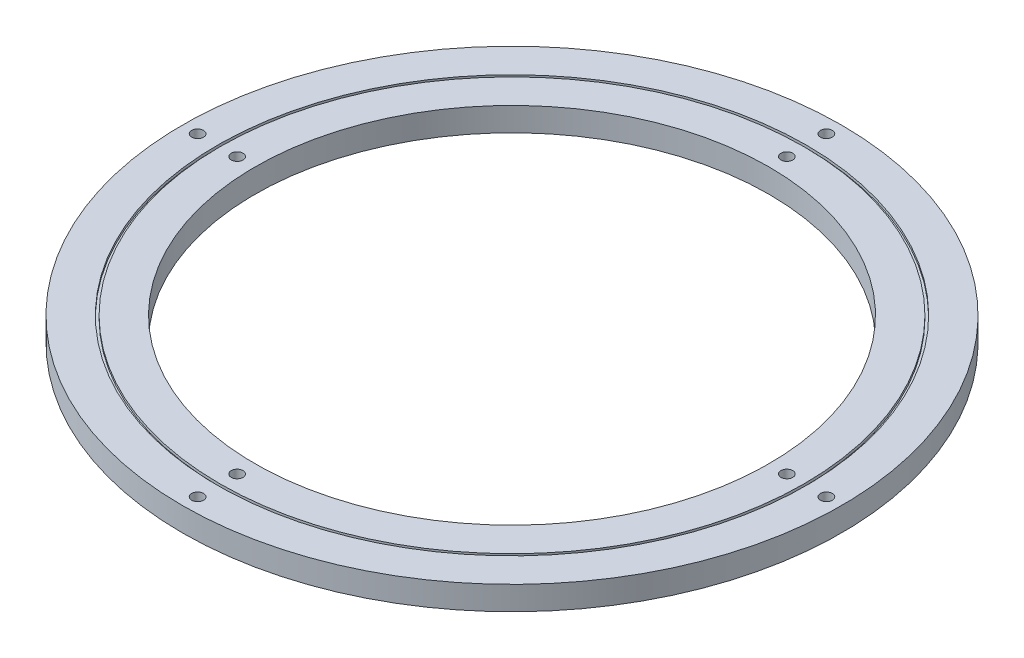
ISO-10303-21;
HEADER;
FILE_DESCRIPTION(('STEP AP214'),'2;1');
FILE_NAME('part.step','',(''),(''),'','','');
FILE_SCHEMA(('AUTOMOTIVE_DESIGN { 1 0 10303 214 1 1 1 1 }'));
ENDSEC;
DATA;
#1=APPLICATION_CONTEXT('core data for automotive mechanical design processes');
#2=APPLICATION_PROTOCOL_DEFINITION('international standard','automotive_design',2000,#1);
#3=PRODUCT_CONTEXT('',#1,'mechanical');
#4=PRODUCT('Part','Part','',(#3));
#5=PRODUCT_RELATED_PRODUCT_CATEGORY('part','',(#4));
#6=PRODUCT_DEFINITION_FORMATION('','',#4);
#7=PRODUCT_DEFINITION_CONTEXT('part definition',#1,'design');
#8=PRODUCT_DEFINITION('design','',#6,#7);
#9=PRODUCT_DEFINITION_SHAPE('','',#8);
#10=(LENGTH_UNIT() NAMED_UNIT(*) SI_UNIT(.MILLI.,.METRE.));
#11=(NAMED_UNIT(*) PLANE_ANGLE_UNIT() SI_UNIT($,.RADIAN.));
#12=(NAMED_UNIT(*) SI_UNIT($,.STERADIAN.) SOLID_ANGLE_UNIT());
#13=UNCERTAINTY_MEASURE_WITH_UNIT(LENGTH_MEASURE(1.E-05),#10,'distance_accuracy_value','');
#14=(GEOMETRIC_REPRESENTATION_CONTEXT(3) GLOBAL_UNCERTAINTY_ASSIGNED_CONTEXT((#13)) GLOBAL_UNIT_ASSIGNED_CONTEXT((#10,
#11,#12)) REPRESENTATION_CONTEXT('',''));
#15=CARTESIAN_POINT('',(0.,0.,0.));
#16=DIRECTION('',(0.,0.,1.));
#17=DIRECTION('',(1.,0.,0.));
#18=AXIS2_PLACEMENT_3D('',#15,#16,#17);
#19=CARTESIAN_POINT('',(-97.5,4.5,0.));
#20=DIRECTION('',(0.,-1.,0.));
#21=DIRECTION('',(0.,0.,-1.));
#22=AXIS2_PLACEMENT_3D('',#19,#20,#21);
#23=PLANE('',#22);
#24=CARTESIAN_POINT('',(0.,4.5,-104.25));
#25=DIRECTION('',(0.,-1.,0.));
#26=DIRECTION('',(0.,0.,-1.));
#27=AXIS2_PLACEMENT_3D('',#24,#25,#26);
#28=CIRCLE('',#27,2.25);
#29=CARTESIAN_POINT('',(0.,4.5,-106.5));
#30=VERTEX_POINT('',#29);
#31=EDGE_CURVE('E139',#30,#30,#28,.T.);
#32=ORIENTED_EDGE('',*,*,#31,.T.);
#33=EDGE_LOOP('',(#32));
#34=FACE_BOUND('',#33,.T.);
#35=CARTESIAN_POINT('',(-104.250000000017,4.5,-1.73906774202997E-11));
#36=DIRECTION('',(0.,-1.,0.));
#37=DIRECTION('',(0.,0.,-1.));
#38=AXIS2_PLACEMENT_3D('',#35,#36,#37);
#39=CIRCLE('',#38,2.25);
#40=CARTESIAN_POINT('',(-104.250000000017,4.5,-2.25000000001739));
#41=VERTEX_POINT('',#40);
#42=EDGE_CURVE('E121',#41,#41,#39,.T.);
#43=ORIENTED_EDGE('',*,*,#42,.T.);
#44=EDGE_LOOP('',(#43));
#45=FACE_BOUND('',#44,.T.);
#46=CARTESIAN_POINT('',(-3.47813548405995E-11,4.5,104.25));
#47=DIRECTION('',(0.,-1.,0.));
#48=DIRECTION('',(0.,0.,-1.));
#49=AXIS2_PLACEMENT_3D('',#46,#47,#48);
#50=CIRCLE('',#49,2.25);
#51=CARTESIAN_POINT('',(-3.47813548405995E-11,4.5,102.));
#52=VERTEX_POINT('',#51);
#53=EDGE_CURVE('E103',#52,#52,#50,.T.);
#54=ORIENTED_EDGE('',*,*,#53,.T.);
#55=EDGE_LOOP('',(#54));
#56=FACE_BOUND('',#55,.T.);
#57=CARTESIAN_POINT('',(104.249999999983,4.5,1.73779104774186E-11));
#58=DIRECTION('',(0.,-1.,0.));
#59=DIRECTION('',(0.,0.,-1.));
#60=AXIS2_PLACEMENT_3D('',#57,#58,#59);
#61=CIRCLE('',#60,2.25);
#62=CARTESIAN_POINT('',(104.249999999983,4.5,-2.24999999998262));
#63=VERTEX_POINT('',#62);
#64=EDGE_CURVE('E85',#63,#63,#61,.T.);
#65=ORIENTED_EDGE('',*,*,#64,.T.);
#66=EDGE_LOOP('',(#65));
#67=FACE_BOUND('',#66,.T.);
#68=CARTESIAN_POINT('',(0.,4.5,0.));
#69=DIRECTION('',(0.,-1.,0.));
#70=DIRECTION('',(0.,0.,-1.));
#71=AXIS2_PLACEMENT_3D('',#68,#69,#70);
#72=CIRCLE('',#71,110.75);
#73=CARTESIAN_POINT('',(0.,4.5,-110.75));
#74=VERTEX_POINT('',#73);
#75=EDGE_CURVE('E10',#74,#74,#72,.T.);
#76=ORIENTED_EDGE('',*,*,#75,.F.);
#77=EDGE_LOOP('',(#76));
#78=FACE_BOUND('',#77,.T.);
#79=CARTESIAN_POINT('',(0.,4.5,0.));
#80=DIRECTION('',(0.,-1.,0.));
#81=DIRECTION('',(0.,0.,-1.));
#82=AXIS2_PLACEMENT_3D('',#79,#80,#81);
#83=CIRCLE('',#82,97.5);
#84=CARTESIAN_POINT('',(0.,4.5,-97.5));
#85=VERTEX_POINT('',#84);
#86=EDGE_CURVE('E73',#85,#85,#83,.T.);
#87=ORIENTED_EDGE('',*,*,#86,.T.);
#88=EDGE_LOOP('',(#87));
#89=FACE_BOUND('',#88,.T.);
#90=ADVANCED_FACE('F33',(#34,#45,#56,#67,#78,#89),#23,.F.);
#91=CARTESIAN_POINT('',(0.,0.,0.));
#92=DIRECTION('',(0.,-1.,0.));
#93=DIRECTION('',(0.,0.,-1.));
#94=AXIS2_PLACEMENT_3D('',#91,#92,#93);
#95=CYLINDRICAL_SURFACE('',#94,110.75);
#96=CARTESIAN_POINT('',(0.,3.5,0.));
#97=DIRECTION('',(0.,-1.,0.));
#98=DIRECTION('',(0.,0.,-1.));
#99=AXIS2_PLACEMENT_3D('',#96,#97,#98);
#100=CIRCLE('',#99,110.75);
#101=CARTESIAN_POINT('',(0.,3.5,-110.75));
#102=VERTEX_POINT('',#101);
#103=EDGE_CURVE('E39',#102,#102,#100,.T.);
#104=ORIENTED_EDGE('',*,*,#103,.F.);
#105=EDGE_LOOP('',(#104));
#106=FACE_BOUND('',#105,.T.);
#107=ORIENTED_EDGE('',*,*,#75,.T.);
#108=EDGE_LOOP('',(#107));
#109=FACE_BOUND('',#108,.T.);
#110=ADVANCED_FACE('F212',(#106,#109),#95,.T.);
#111=CARTESIAN_POINT('',(-110.75,3.5,0.));
#112=DIRECTION('',(0.,-1.,0.));
#113=DIRECTION('',(0.,0.,-1.));
#114=AXIS2_PLACEMENT_3D('',#111,#112,#113);
#115=PLANE('',#114);
#116=CARTESIAN_POINT('',(0.,3.5,0.));
#117=DIRECTION('',(0.,-1.,0.));
#118=DIRECTION('',(0.,0.,-1.));
#119=AXIS2_PLACEMENT_3D('',#116,#117,#118);
#120=CIRCLE('',#119,111.75);
#121=CARTESIAN_POINT('',(0.,3.5,-111.75));
#122=VERTEX_POINT('',#121);
#123=EDGE_CURVE('E43',#122,#122,#120,.T.);
#124=ORIENTED_EDGE('',*,*,#123,.F.);
#125=EDGE_LOOP('',(#124));
#126=FACE_BOUND('',#125,.T.);
#127=ORIENTED_EDGE('',*,*,#103,.T.);
#128=EDGE_LOOP('',(#127));
#129=FACE_BOUND('',#128,.T.);
#130=ADVANCED_FACE('F207',(#126,#129),#115,.F.);
#131=CARTESIAN_POINT('',(0.,0.,0.));
#132=DIRECTION('',(0.,-1.,0.));
#133=DIRECTION('',(0.,0.,-1.));
#134=AXIS2_PLACEMENT_3D('',#131,#132,#133);
#135=CYLINDRICAL_SURFACE('',#134,111.75);
#136=CARTESIAN_POINT('',(0.,4.5,0.));
#137=DIRECTION('',(0.,-1.,0.));
#138=DIRECTION('',(0.,0.,-1.));
#139=AXIS2_PLACEMENT_3D('',#136,#137,#138);
#140=CIRCLE('',#139,111.75);
#141=CARTESIAN_POINT('',(0.,4.5,-111.75));
#142=VERTEX_POINT('',#141);
#143=EDGE_CURVE('E47',#142,#142,#140,.T.);
#144=ORIENTED_EDGE('',*,*,#143,.F.);
#145=EDGE_LOOP('',(#144));
#146=FACE_BOUND('',#145,.T.);
#147=ORIENTED_EDGE('',*,*,#123,.T.);
#148=EDGE_LOOP('',(#147));
#149=FACE_BOUND('',#148,.T.);
#150=ADVANCED_FACE('F200',(#146,#149),#135,.F.);
#151=CARTESIAN_POINT('',(-111.75,4.5,0.));
#152=DIRECTION('',(0.,-1.,0.));
#153=DIRECTION('',(0.,0.,-1.));
#154=AXIS2_PLACEMENT_3D('',#151,#152,#153);
#155=PLANE('',#154);
#156=CARTESIAN_POINT('',(0.,4.5,-119.25));
#157=DIRECTION('',(0.,-1.,0.));
#158=DIRECTION('',(0.,0.,-1.));
#159=AXIS2_PLACEMENT_3D('',#156,#157,#158);
#160=CIRCLE('',#159,2.25);
#161=CARTESIAN_POINT('',(0.,4.5,-121.5));
#162=VERTEX_POINT('',#161);
#163=EDGE_CURVE('E130',#162,#162,#160,.T.);
#164=ORIENTED_EDGE('',*,*,#163,.T.);
#165=EDGE_LOOP('',(#164));
#166=FACE_BOUND('',#165,.T.);
#167=CARTESIAN_POINT('',(-119.250000000017,4.5,-1.73915959053991E-11));
#168=DIRECTION('',(0.,-1.,0.));
#169=DIRECTION('',(0.,0.,-1.));
#170=AXIS2_PLACEMENT_3D('',#167,#168,#169);
#171=CIRCLE('',#170,2.25);
#172=CARTESIAN_POINT('',(-119.250000000017,4.5,-2.25000000001739));
#173=VERTEX_POINT('',#172);
#174=EDGE_CURVE('E112',#173,#173,#171,.T.);
#175=ORIENTED_EDGE('',*,*,#174,.T.);
#176=EDGE_LOOP('',(#175));
#177=FACE_BOUND('',#176,.T.);
#178=CARTESIAN_POINT('',(-3.47831918107982E-11,4.5,119.25));
#179=DIRECTION('',(0.,-1.,0.));
#180=DIRECTION('',(0.,0.,-1.));
#181=AXIS2_PLACEMENT_3D('',#178,#179,#180);
#182=CIRCLE('',#181,2.25);
#183=CARTESIAN_POINT('',(-3.47831918107982E-11,4.5,117.));
#184=VERTEX_POINT('',#183);
#185=EDGE_CURVE('E94',#184,#184,#182,.T.);
#186=ORIENTED_EDGE('',*,*,#185,.T.);
#187=EDGE_LOOP('',(#186));
#188=FACE_BOUND('',#187,.T.);
#189=CARTESIAN_POINT('',(119.249999999983,4.5,1.73769919923193E-11));
#190=DIRECTION('',(0.,-1.,0.));
#191=DIRECTION('',(0.,0.,-1.));
#192=AXIS2_PLACEMENT_3D('',#189,#190,#191);
#193=CIRCLE('',#192,2.25);
#194=CARTESIAN_POINT('',(119.249999999983,4.5,-2.24999999998263));
#195=VERTEX_POINT('',#194);
#196=EDGE_CURVE('E76',#195,#195,#193,.T.);
#197=ORIENTED_EDGE('',*,*,#196,.T.);
#198=EDGE_LOOP('',(#197));
#199=FACE_BOUND('',#198,.T.);
#200=CARTESIAN_POINT('',(0.,4.5,0.));
#201=DIRECTION('',(0.,-1.,0.));
#202=DIRECTION('',(0.,0.,-1.));
#203=AXIS2_PLACEMENT_3D('',#200,#201,#202);
#204=CIRCLE('',#203,125.);
#205=CARTESIAN_POINT('',(0.,4.5,-125.));
#206=VERTEX_POINT('',#205);
#207=EDGE_CURVE('E52',#206,#206,#204,.T.);
#208=ORIENTED_EDGE('',*,*,#207,.F.);
#209=EDGE_LOOP('',(#208));
#210=FACE_BOUND('',#209,.T.);
#211=ORIENTED_EDGE('',*,*,#143,.T.);
#212=EDGE_LOOP('',(#211));
#213=FACE_BOUND('',#212,.T.);
#214=ADVANCED_FACE('F194',(#166,#177,#188,#199,#210,#213),#155,.F.);
#215=CARTESIAN_POINT('',(0.,0.,0.));
#216=DIRECTION('',(0.,-1.,0.));
#217=DIRECTION('',(0.,0.,-1.));
#218=AXIS2_PLACEMENT_3D('',#215,#216,#217);
#219=CYLINDRICAL_SURFACE('',#218,125.);
#220=CARTESIAN_POINT('',(0.,-4.5,0.));
#221=DIRECTION('',(0.,-1.,0.));
#222=DIRECTION('',(0.,0.,-1.));
#223=AXIS2_PLACEMENT_3D('',#220,#221,#222);
#224=CIRCLE('',#223,125.);
#225=CARTESIAN_POINT('',(0.,-4.5,-125.));
#226=VERTEX_POINT('',#225);
#227=EDGE_CURVE('E55',#226,#226,#224,.T.);
#228=ORIENTED_EDGE('',*,*,#227,.F.);
#229=EDGE_LOOP('',(#228));
#230=FACE_BOUND('',#229,.T.);
#231=ORIENTED_EDGE('',*,*,#207,.T.);
#232=EDGE_LOOP('',(#231));
#233=FACE_BOUND('',#232,.T.);
#234=ADVANCED_FACE('F187',(#230,#233),#219,.T.);
#235=CARTESIAN_POINT('',(-111.75,-4.5,0.));
#236=DIRECTION('',(0.,1.,0.));
#237=DIRECTION('',(0.,0.,1.));
#238=AXIS2_PLACEMENT_3D('',#235,#236,#237);
#239=PLANE('',#238);
#240=CARTESIAN_POINT('',(0.,-4.5,-119.25));
#241=DIRECTION('',(0.,-1.,0.));
#242=DIRECTION('',(0.,0.,-1.));
#243=AXIS2_PLACEMENT_3D('',#240,#241,#242);
#244=CIRCLE('',#243,4.7);
#245=CARTESIAN_POINT('',(0.,-4.5,-123.95));
#246=VERTEX_POINT('',#245);
#247=EDGE_CURVE('E136',#246,#246,#244,.T.);
#248=ORIENTED_EDGE('',*,*,#247,.F.);
#249=EDGE_LOOP('',(#248));
#250=FACE_BOUND('',#249,.T.);
#251=CARTESIAN_POINT('',(-119.250000000017,-4.5,-1.73915959053991E-11));
#252=DIRECTION('',(0.,-1.,0.));
#253=DIRECTION('',(0.,0.,-1.));
#254=AXIS2_PLACEMENT_3D('',#251,#252,#253);
#255=CIRCLE('',#254,4.7);
#256=CARTESIAN_POINT('',(-119.250000000017,-4.5,-4.70000000001739));
#257=VERTEX_POINT('',#256);
#258=EDGE_CURVE('E118',#257,#257,#255,.T.);
#259=ORIENTED_EDGE('',*,*,#258,.F.);
#260=EDGE_LOOP('',(#259));
#261=FACE_BOUND('',#260,.T.);
#262=CARTESIAN_POINT('',(-3.47831918107982E-11,-4.5,119.25));
#263=DIRECTION('',(0.,-1.,0.));
#264=DIRECTION('',(0.,0.,-1.));
#265=AXIS2_PLACEMENT_3D('',#262,#263,#264);
#266=CIRCLE('',#265,4.7);
#267=CARTESIAN_POINT('',(-3.47831918107982E-11,-4.5,114.55));
#268=VERTEX_POINT('',#267);
#269=EDGE_CURVE('E100',#268,#268,#266,.T.);
#270=ORIENTED_EDGE('',*,*,#269,.F.);
#271=EDGE_LOOP('',(#270));
#272=FACE_BOUND('',#271,.T.);
#273=CARTESIAN_POINT('',(119.249999999983,-4.5,1.73769919923193E-11));
#274=DIRECTION('',(0.,-1.,0.));
#275=DIRECTION('',(0.,0.,-1.));
#276=AXIS2_PLACEMENT_3D('',#273,#274,#275);
#277=CIRCLE('',#276,4.7);
#278=CARTESIAN_POINT('',(119.249999999983,-4.5,-4.69999999998262));
#279=VERTEX_POINT('',#278);
#280=EDGE_CURVE('E82',#279,#279,#277,.T.);
#281=ORIENTED_EDGE('',*,*,#280,.F.);
#282=EDGE_LOOP('',(#281));
#283=FACE_BOUND('',#282,.T.);
#284=CARTESIAN_POINT('',(0.,-4.5,0.));
#285=DIRECTION('',(0.,-1.,0.));
#286=DIRECTION('',(0.,0.,-1.));
#287=AXIS2_PLACEMENT_3D('',#284,#285,#286);
#288=CIRCLE('',#287,111.75);
#289=CARTESIAN_POINT('',(0.,-4.5,-111.75));
#290=VERTEX_POINT('',#289);
#291=EDGE_CURVE('E58',#290,#290,#288,.T.);
#292=ORIENTED_EDGE('',*,*,#291,.F.);
#293=EDGE_LOOP('',(#292));
#294=FACE_BOUND('',#293,.T.);
#295=ORIENTED_EDGE('',*,*,#227,.T.);
#296=EDGE_LOOP('',(#295));
#297=FACE_BOUND('',#296,.T.);
#298=ADVANCED_FACE('F181',(#250,#261,#272,#283,#294,#297),#239,.F.);
#299=CARTESIAN_POINT('',(0.,0.,0.));
#300=DIRECTION('',(0.,-1.,0.));
#301=DIRECTION('',(0.,0.,-1.));
#302=AXIS2_PLACEMENT_3D('',#299,#300,#301);
#303=CYLINDRICAL_SURFACE('',#302,111.75);
#304=CARTESIAN_POINT('',(0.,-3.5,0.));
#305=DIRECTION('',(0.,-1.,0.));
#306=DIRECTION('',(0.,0.,-1.));
#307=AXIS2_PLACEMENT_3D('',#304,#305,#306);
#308=CIRCLE('',#307,111.75);
#309=CARTESIAN_POINT('',(0.,-3.5,-111.75));
#310=VERTEX_POINT('',#309);
#311=EDGE_CURVE('E61',#310,#310,#308,.T.);
#312=ORIENTED_EDGE('',*,*,#311,.F.);
#313=EDGE_LOOP('',(#312));
#314=FACE_BOUND('',#313,.T.);
#315=ORIENTED_EDGE('',*,*,#291,.T.);
#316=EDGE_LOOP('',(#315));
#317=FACE_BOUND('',#316,.T.);
#318=ADVANCED_FACE('F175',(#314,#317),#303,.F.);
#319=CARTESIAN_POINT('',(-110.75,-3.5,0.));
#320=DIRECTION('',(0.,1.,0.));
#321=DIRECTION('',(0.,0.,1.));
#322=AXIS2_PLACEMENT_3D('',#319,#320,#321);
#323=PLANE('',#322);
#324=CARTESIAN_POINT('',(0.,-3.5,0.));
#325=DIRECTION('',(0.,-1.,0.));
#326=DIRECTION('',(0.,0.,-1.));
#327=AXIS2_PLACEMENT_3D('',#324,#325,#326);
#328=CIRCLE('',#327,110.75);
#329=CARTESIAN_POINT('',(0.,-3.5,-110.75));
#330=VERTEX_POINT('',#329);
#331=EDGE_CURVE('E64',#330,#330,#328,.T.);
#332=ORIENTED_EDGE('',*,*,#331,.F.);
#333=EDGE_LOOP('',(#332));
#334=FACE_BOUND('',#333,.T.);
#335=ORIENTED_EDGE('',*,*,#311,.T.);
#336=EDGE_LOOP('',(#335));
#337=FACE_BOUND('',#336,.T.);
#338=ADVANCED_FACE('F169',(#334,#337),#323,.F.);
#339=CARTESIAN_POINT('',(0.,0.,0.));
#340=DIRECTION('',(0.,-1.,0.));
#341=DIRECTION('',(0.,0.,-1.));
#342=AXIS2_PLACEMENT_3D('',#339,#340,#341);
#343=CYLINDRICAL_SURFACE('',#342,110.75);
#344=CARTESIAN_POINT('',(0.,-4.5,0.));
#345=DIRECTION('',(0.,-1.,0.));
#346=DIRECTION('',(0.,0.,-1.));
#347=AXIS2_PLACEMENT_3D('',#344,#345,#346);
#348=CIRCLE('',#347,110.75);
#349=CARTESIAN_POINT('',(0.,-4.5,-110.75));
#350=VERTEX_POINT('',#349);
#351=EDGE_CURVE('E67',#350,#350,#348,.T.);
#352=ORIENTED_EDGE('',*,*,#351,.F.);
#353=EDGE_LOOP('',(#352));
#354=FACE_BOUND('',#353,.T.);
#355=ORIENTED_EDGE('',*,*,#331,.T.);
#356=EDGE_LOOP('',(#355));
#357=FACE_BOUND('',#356,.T.);
#358=ADVANCED_FACE('F155',(#354,#357),#343,.T.);
#359=CARTESIAN_POINT('',(-97.5,-4.5,0.));
#360=DIRECTION('',(0.,1.,0.));
#361=DIRECTION('',(0.,0.,1.));
#362=AXIS2_PLACEMENT_3D('',#359,#360,#361);
#363=PLANE('',#362);
#364=CARTESIAN_POINT('',(0.,-4.5,-104.25));
#365=DIRECTION('',(0.,-1.,0.));
#366=DIRECTION('',(0.,0.,-1.));
#367=AXIS2_PLACEMENT_3D('',#364,#365,#366);
#368=CIRCLE('',#367,4.7);
#369=CARTESIAN_POINT('',(0.,-4.5,-108.95));
#370=VERTEX_POINT('',#369);
#371=EDGE_CURVE('E145',#370,#370,#368,.T.);
#372=ORIENTED_EDGE('',*,*,#371,.F.);
#373=EDGE_LOOP('',(#372));
#374=FACE_BOUND('',#373,.T.);
#375=CARTESIAN_POINT('',(-104.250000000017,-4.5,-1.73906774202997E-11));
#376=DIRECTION('',(0.,-1.,0.));
#377=DIRECTION('',(0.,0.,-1.));
#378=AXIS2_PLACEMENT_3D('',#375,#376,#377);
#379=CIRCLE('',#378,4.7);
#380=CARTESIAN_POINT('',(-104.250000000017,-4.5,-4.70000000001739));
#381=VERTEX_POINT('',#380);
#382=EDGE_CURVE('E127',#381,#381,#379,.T.);
#383=ORIENTED_EDGE('',*,*,#382,.F.);
#384=EDGE_LOOP('',(#383));
#385=FACE_BOUND('',#384,.T.);
#386=CARTESIAN_POINT('',(-3.47813548405995E-11,-4.5,104.25));
#387=DIRECTION('',(0.,-1.,0.));
#388=DIRECTION('',(0.,0.,-1.));
#389=AXIS2_PLACEMENT_3D('',#386,#387,#388);
#390=CIRCLE('',#389,4.7);
#391=CARTESIAN_POINT('',(-3.47813548405995E-11,-4.5,99.55));
#392=VERTEX_POINT('',#391);
#393=EDGE_CURVE('E109',#392,#392,#390,.T.);
#394=ORIENTED_EDGE('',*,*,#393,.F.);
#395=EDGE_LOOP('',(#394));
#396=FACE_BOUND('',#395,.T.);
#397=CARTESIAN_POINT('',(104.249999999983,-4.5,1.73779104774186E-11));
#398=DIRECTION('',(0.,-1.,0.));
#399=DIRECTION('',(0.,0.,-1.));
#400=AXIS2_PLACEMENT_3D('',#397,#398,#399);
#401=CIRCLE('',#400,4.7);
#402=CARTESIAN_POINT('',(104.249999999983,-4.5,-4.69999999998262));
#403=VERTEX_POINT('',#402);
#404=EDGE_CURVE('E91',#403,#403,#401,.T.);
#405=ORIENTED_EDGE('',*,*,#404,.F.);
#406=EDGE_LOOP('',(#405));
#407=FACE_BOUND('',#406,.T.);
#408=CARTESIAN_POINT('',(0.,-4.5,0.));
#409=DIRECTION('',(0.,-1.,0.));
#410=DIRECTION('',(0.,0.,-1.));
#411=AXIS2_PLACEMENT_3D('',#408,#409,#410);
#412=CIRCLE('',#411,97.5);
#413=CARTESIAN_POINT('',(0.,-4.5,-97.5));
#414=VERTEX_POINT('',#413);
#415=EDGE_CURVE('E70',#414,#414,#412,.T.);
#416=ORIENTED_EDGE('',*,*,#415,.F.);
#417=EDGE_LOOP('',(#416));
#418=FACE_BOUND('',#417,.T.);
#419=ORIENTED_EDGE('',*,*,#351,.T.);
#420=EDGE_LOOP('',(#419));
#421=FACE_BOUND('',#420,.T.);
#422=ADVANCED_FACE('F151',(#374,#385,#396,#407,#418,#421),#363,.F.);
#423=CARTESIAN_POINT('',(0.,0.,0.));
#424=DIRECTION('',(0.,-1.,0.));
#425=DIRECTION('',(0.,0.,-1.));
#426=AXIS2_PLACEMENT_3D('',#423,#424,#425);
#427=CYLINDRICAL_SURFACE('',#426,97.5);
#428=ORIENTED_EDGE('',*,*,#86,.F.);
#429=EDGE_LOOP('',(#428));
#430=FACE_BOUND('',#429,.T.);
#431=ORIENTED_EDGE('',*,*,#415,.T.);
#432=EDGE_LOOP('',(#431));
#433=FACE_BOUND('',#432,.T.);
#434=ADVANCED_FACE('F154',(#430,#433),#427,.F.);
#435=CARTESIAN_POINT('',(119.249999999983,-4.5,1.73769919923193E-11));
#436=DIRECTION('',(0.,-1.,0.));
#437=DIRECTION('',(0.,0.,-1.));
#438=AXIS2_PLACEMENT_3D('',#435,#436,#437);
#439=CYLINDRICAL_SURFACE('',#438,2.25);
#440=ORIENTED_EDGE('',*,*,#196,.F.);
#441=EDGE_LOOP('',(#440));
#442=FACE_BOUND('',#441,.T.);
#443=CARTESIAN_POINT('',(119.249999999983,-2.05,1.73769919923193E-11));
#444=DIRECTION('',(0.,-1.,0.));
#445=DIRECTION('',(0.,0.,-1.));
#446=AXIS2_PLACEMENT_3D('',#443,#444,#445);
#447=CIRCLE('',#446,2.25);
#448=CARTESIAN_POINT('',(119.249999999983,-2.05,-2.24999999998263));
#449=VERTEX_POINT('',#448);
#450=EDGE_CURVE('E79',#449,#449,#447,.T.);
#451=ORIENTED_EDGE('',*,*,#450,.T.);
#452=EDGE_LOOP('',(#451));
#453=FACE_BOUND('',#452,.T.);
#454=ADVANCED_FACE('F235',(#442,#453),#439,.F.);
#455=CARTESIAN_POINT('',(119.249999999983,-4.5,1.73769919923193E-11));
#456=DIRECTION('',(0.,-1.,0.));
#457=DIRECTION('',(0.,0.,-1.));
#458=AXIS2_PLACEMENT_3D('',#455,#456,#457);
#459=CONICAL_SURFACE('',#458,4.7,0.785398163397447);
#460=ORIENTED_EDGE('',*,*,#450,.F.);
#461=EDGE_LOOP('',(#460));
#462=FACE_BOUND('',#461,.T.);
#463=ORIENTED_EDGE('',*,*,#280,.T.);
#464=EDGE_LOOP('',(#463));
#465=FACE_BOUND('',#464,.T.);
#466=ADVANCED_FACE('F240',(#462,#465),#459,.F.);
#467=CARTESIAN_POINT('',(104.249999999983,-4.5,1.73779104774186E-11));
#468=DIRECTION('',(0.,-1.,0.));
#469=DIRECTION('',(0.,0.,-1.));
#470=AXIS2_PLACEMENT_3D('',#467,#468,#469);
#471=CYLINDRICAL_SURFACE('',#470,2.25);
#472=ORIENTED_EDGE('',*,*,#64,.F.);
#473=EDGE_LOOP('',(#472));
#474=FACE_BOUND('',#473,.T.);
#475=CARTESIAN_POINT('',(104.249999999983,-2.05,1.73779104774186E-11));
#476=DIRECTION('',(0.,-1.,0.));
#477=DIRECTION('',(0.,0.,-1.));
#478=AXIS2_PLACEMENT_3D('',#475,#476,#477);
#479=CIRCLE('',#478,2.25);
#480=CARTESIAN_POINT('',(104.249999999983,-2.05,-2.24999999998262));
#481=VERTEX_POINT('',#480);
#482=EDGE_CURVE('E88',#481,#481,#479,.T.);
#483=ORIENTED_EDGE('',*,*,#482,.T.);
#484=EDGE_LOOP('',(#483));
#485=FACE_BOUND('',#484,.T.);
#486=ADVANCED_FACE('F246',(#474,#485),#471,.F.);
#487=CARTESIAN_POINT('',(104.249999999983,-4.5,1.73779104774186E-11));
#488=DIRECTION('',(0.,-1.,0.));
#489=DIRECTION('',(0.,0.,-1.));
#490=AXIS2_PLACEMENT_3D('',#487,#488,#489);
#491=CONICAL_SURFACE('',#490,4.7,0.785398163397447);
#492=ORIENTED_EDGE('',*,*,#482,.F.);
#493=EDGE_LOOP('',(#492));
#494=FACE_BOUND('',#493,.T.);
#495=ORIENTED_EDGE('',*,*,#404,.T.);
#496=EDGE_LOOP('',(#495));
#497=FACE_BOUND('',#496,.T.);
#498=ADVANCED_FACE('F250',(#494,#497),#491,.F.);
#499=CARTESIAN_POINT('',(-3.47831918107982E-11,-4.5,119.25));
#500=DIRECTION('',(0.,-1.,0.));
#501=DIRECTION('',(0.,0.,-1.));
#502=AXIS2_PLACEMENT_3D('',#499,#500,#501);
#503=CYLINDRICAL_SURFACE('',#502,2.25);
#504=ORIENTED_EDGE('',*,*,#185,.F.);
#505=EDGE_LOOP('',(#504));
#506=FACE_BOUND('',#505,.T.);
#507=CARTESIAN_POINT('',(-3.47831918107982E-11,-2.05,119.25));
#508=DIRECTION('',(0.,-1.,0.));
#509=DIRECTION('',(0.,0.,-1.));
#510=AXIS2_PLACEMENT_3D('',#507,#508,#509);
#511=CIRCLE('',#510,2.25);
#512=CARTESIAN_POINT('',(-3.47831918107982E-11,-2.05,117.));
#513=VERTEX_POINT('',#512);
#514=EDGE_CURVE('E97',#513,#513,#511,.T.);
#515=ORIENTED_EDGE('',*,*,#514,.T.);
#516=EDGE_LOOP('',(#515));
#517=FACE_BOUND('',#516,.T.);
#518=ADVANCED_FACE('F254',(#506,#517),#503,.F.);
#519=CARTESIAN_POINT('',(-3.47831918107982E-11,-4.5,119.25));
#520=DIRECTION('',(0.,-1.,0.));
#521=DIRECTION('',(0.,0.,-1.));
#522=AXIS2_PLACEMENT_3D('',#519,#520,#521);
#523=CONICAL_SURFACE('',#522,4.7,0.785398163397448);
#524=ORIENTED_EDGE('',*,*,#514,.F.);
#525=EDGE_LOOP('',(#524));
#526=FACE_BOUND('',#525,.T.);
#527=ORIENTED_EDGE('',*,*,#269,.T.);
#528=EDGE_LOOP('',(#527));
#529=FACE_BOUND('',#528,.T.);
#530=ADVANCED_FACE('F258',(#526,#529),#523,.F.);
#531=CARTESIAN_POINT('',(-3.47813548405995E-11,-4.5,104.25));
#532=DIRECTION('',(0.,-1.,0.));
#533=DIRECTION('',(0.,0.,-1.));
#534=AXIS2_PLACEMENT_3D('',#531,#532,#533);
#535=CYLINDRICAL_SURFACE('',#534,2.25);
#536=ORIENTED_EDGE('',*,*,#53,.F.);
#537=EDGE_LOOP('',(#536));
#538=FACE_BOUND('',#537,.T.);
#539=CARTESIAN_POINT('',(-3.47813548405995E-11,-2.05,104.25));
#540=DIRECTION('',(0.,-1.,0.));
#541=DIRECTION('',(0.,0.,-1.));
#542=AXIS2_PLACEMENT_3D('',#539,#540,#541);
#543=CIRCLE('',#542,2.25);
#544=CARTESIAN_POINT('',(-3.47813548405995E-11,-2.05,102.));
#545=VERTEX_POINT('',#544);
#546=EDGE_CURVE('E106',#545,#545,#543,.T.);
#547=ORIENTED_EDGE('',*,*,#546,.T.);
#548=EDGE_LOOP('',(#547));
#549=FACE_BOUND('',#548,.T.);
#550=ADVANCED_FACE('F262',(#538,#549),#535,.F.);
#551=CARTESIAN_POINT('',(-3.47813548405995E-11,-4.5,104.25));
#552=DIRECTION('',(0.,-1.,0.));
#553=DIRECTION('',(0.,0.,-1.));
#554=AXIS2_PLACEMENT_3D('',#551,#552,#553);
#555=CONICAL_SURFACE('',#554,4.7,0.785398163397448);
#556=ORIENTED_EDGE('',*,*,#546,.F.);
#557=EDGE_LOOP('',(#556));
#558=FACE_BOUND('',#557,.T.);
#559=ORIENTED_EDGE('',*,*,#393,.T.);
#560=EDGE_LOOP('',(#559));
#561=FACE_BOUND('',#560,.T.);
#562=ADVANCED_FACE('F266',(#558,#561),#555,.F.);
#563=CARTESIAN_POINT('',(-119.250000000017,-4.5,-1.73915959053991E-11));
#564=DIRECTION('',(0.,-1.,0.));
#565=DIRECTION('',(0.,0.,-1.));
#566=AXIS2_PLACEMENT_3D('',#563,#564,#565);
#567=CYLINDRICAL_SURFACE('',#566,2.25);
#568=ORIENTED_EDGE('',*,*,#174,.F.);
#569=EDGE_LOOP('',(#568));
#570=FACE_BOUND('',#569,.T.);
#571=CARTESIAN_POINT('',(-119.250000000017,-2.05,-1.73915959053991E-11));
#572=DIRECTION('',(0.,-1.,0.));
#573=DIRECTION('',(0.,0.,-1.));
#574=AXIS2_PLACEMENT_3D('',#571,#572,#573);
#575=CIRCLE('',#574,2.25);
#576=CARTESIAN_POINT('',(-119.250000000017,-2.05,-2.25000000001739));
#577=VERTEX_POINT('',#576);
#578=EDGE_CURVE('E115',#577,#577,#575,.T.);
#579=ORIENTED_EDGE('',*,*,#578,.T.);
#580=EDGE_LOOP('',(#579));
#581=FACE_BOUND('',#580,.T.);
#582=ADVANCED_FACE('F270',(#570,#581),#567,.F.);
#583=CARTESIAN_POINT('',(-119.250000000017,-4.5,-1.73915959053991E-11));
#584=DIRECTION('',(0.,-1.,0.));
#585=DIRECTION('',(0.,0.,-1.));
#586=AXIS2_PLACEMENT_3D('',#583,#584,#585);
#587=CONICAL_SURFACE('',#586,4.7,0.785398163397447);
#588=ORIENTED_EDGE('',*,*,#578,.F.);
#589=EDGE_LOOP('',(#588));
#590=FACE_BOUND('',#589,.T.);
#591=ORIENTED_EDGE('',*,*,#258,.T.);
#592=EDGE_LOOP('',(#591));
#593=FACE_BOUND('',#592,.T.);
#594=ADVANCED_FACE('F274',(#590,#593),#587,.F.);
#595=CARTESIAN_POINT('',(-104.250000000017,-4.5,-1.73906774202997E-11));
#596=DIRECTION('',(0.,-1.,0.));
#597=DIRECTION('',(0.,0.,-1.));
#598=AXIS2_PLACEMENT_3D('',#595,#596,#597);
#599=CYLINDRICAL_SURFACE('',#598,2.25);
#600=ORIENTED_EDGE('',*,*,#42,.F.);
#601=EDGE_LOOP('',(#600));
#602=FACE_BOUND('',#601,.T.);
#603=CARTESIAN_POINT('',(-104.250000000017,-2.05,-1.73906774202997E-11));
#604=DIRECTION('',(0.,-1.,0.));
#605=DIRECTION('',(0.,0.,-1.));
#606=AXIS2_PLACEMENT_3D('',#603,#604,#605);
#607=CIRCLE('',#606,2.25);
#608=CARTESIAN_POINT('',(-104.250000000017,-2.05,-2.25000000001739));
#609=VERTEX_POINT('',#608);
#610=EDGE_CURVE('E124',#609,#609,#607,.T.);
#611=ORIENTED_EDGE('',*,*,#610,.T.);
#612=EDGE_LOOP('',(#611));
#613=FACE_BOUND('',#612,.T.);
#614=ADVANCED_FACE('F278',(#602,#613),#599,.F.);
#615=CARTESIAN_POINT('',(-104.250000000017,-4.5,-1.73906774202997E-11));
#616=DIRECTION('',(0.,-1.,0.));
#617=DIRECTION('',(0.,0.,-1.));
#618=AXIS2_PLACEMENT_3D('',#615,#616,#617);
#619=CONICAL_SURFACE('',#618,4.7,0.785398163397447);
#620=ORIENTED_EDGE('',*,*,#610,.F.);
#621=EDGE_LOOP('',(#620));
#622=FACE_BOUND('',#621,.T.);
#623=ORIENTED_EDGE('',*,*,#382,.T.);
#624=EDGE_LOOP('',(#623));
#625=FACE_BOUND('',#624,.T.);
#626=ADVANCED_FACE('F282',(#622,#625),#619,.F.);
#627=CARTESIAN_POINT('',(0.,-4.5,-119.25));
#628=DIRECTION('',(0.,-1.,0.));
#629=DIRECTION('',(0.,0.,-1.));
#630=AXIS2_PLACEMENT_3D('',#627,#628,#629);
#631=CYLINDRICAL_SURFACE('',#630,2.25);
#632=ORIENTED_EDGE('',*,*,#163,.F.);
#633=EDGE_LOOP('',(#632));
#634=FACE_BOUND('',#633,.T.);
#635=CARTESIAN_POINT('',(0.,-2.05,-119.25));
#636=DIRECTION('',(0.,-1.,0.));
#637=DIRECTION('',(0.,0.,-1.));
#638=AXIS2_PLACEMENT_3D('',#635,#636,#637);
#639=CIRCLE('',#638,2.25);
#640=CARTESIAN_POINT('',(0.,-2.05,-121.5));
#641=VERTEX_POINT('',#640);
#642=EDGE_CURVE('E133',#641,#641,#639,.T.);
#643=ORIENTED_EDGE('',*,*,#642,.T.);
#644=EDGE_LOOP('',(#643));
#645=FACE_BOUND('',#644,.T.);
#646=ADVANCED_FACE('F286',(#634,#645),#631,.F.);
#647=CARTESIAN_POINT('',(0.,-4.5,-119.25));
#648=DIRECTION('',(0.,-1.,0.));
#649=DIRECTION('',(0.,0.,-1.));
#650=AXIS2_PLACEMENT_3D('',#647,#648,#649);
#651=CONICAL_SURFACE('',#650,4.7,0.785398163397448);
#652=ORIENTED_EDGE('',*,*,#642,.F.);
#653=EDGE_LOOP('',(#652));
#654=FACE_BOUND('',#653,.T.);
#655=ORIENTED_EDGE('',*,*,#247,.T.);
#656=EDGE_LOOP('',(#655));
#657=FACE_BOUND('',#656,.T.);
#658=ADVANCED_FACE('F290',(#654,#657),#651,.F.);
#659=CARTESIAN_POINT('',(0.,-4.5,-104.25));
#660=DIRECTION('',(0.,-1.,0.));
#661=DIRECTION('',(0.,0.,-1.));
#662=AXIS2_PLACEMENT_3D('',#659,#660,#661);
#663=CYLINDRICAL_SURFACE('',#662,2.25);
#664=ORIENTED_EDGE('',*,*,#31,.F.);
#665=EDGE_LOOP('',(#664));
#666=FACE_BOUND('',#665,.T.);
#667=CARTESIAN_POINT('',(0.,-2.05,-104.25));
#668=DIRECTION('',(0.,-1.,0.));
#669=DIRECTION('',(0.,0.,-1.));
#670=AXIS2_PLACEMENT_3D('',#667,#668,#669);
#671=CIRCLE('',#670,2.25);
#672=CARTESIAN_POINT('',(0.,-2.05,-106.5));
#673=VERTEX_POINT('',#672);
#674=EDGE_CURVE('E142',#673,#673,#671,.T.);
#675=ORIENTED_EDGE('',*,*,#674,.T.);
#676=EDGE_LOOP('',(#675));
#677=FACE_BOUND('',#676,.T.);
#678=ADVANCED_FACE('F294',(#666,#677),#663,.F.);
#679=CARTESIAN_POINT('',(0.,-4.5,-104.25));
#680=DIRECTION('',(0.,-1.,0.));
#681=DIRECTION('',(0.,0.,-1.));
#682=AXIS2_PLACEMENT_3D('',#679,#680,#681);
#683=CONICAL_SURFACE('',#682,4.7,0.785398163397448);
#684=ORIENTED_EDGE('',*,*,#674,.F.);
#685=EDGE_LOOP('',(#684));
#686=FACE_BOUND('',#685,.T.);
#687=ORIENTED_EDGE('',*,*,#371,.T.);
#688=EDGE_LOOP('',(#687));
#689=FACE_BOUND('',#688,.T.);
#690=ADVANCED_FACE('F149',(#686,#689),#683,.F.);
#691=CLOSED_SHELL('',(#90,#110,#130,#150,#214,#234,#298,#318,#338,#358,#422,#434,#454,#466,#486,
#498,#518,#530,#550,#562,#582,#594,#614,#626,#646,#658,#678,#690));
#692=MANIFOLD_SOLID_BREP('B2',#691);
#693=ADVANCED_BREP_SHAPE_REPRESENTATION('',(#18,#692),#14);
#694=SHAPE_DEFINITION_REPRESENTATION(#9,#693);
ENDSEC;
END-ISO-10303-21;
